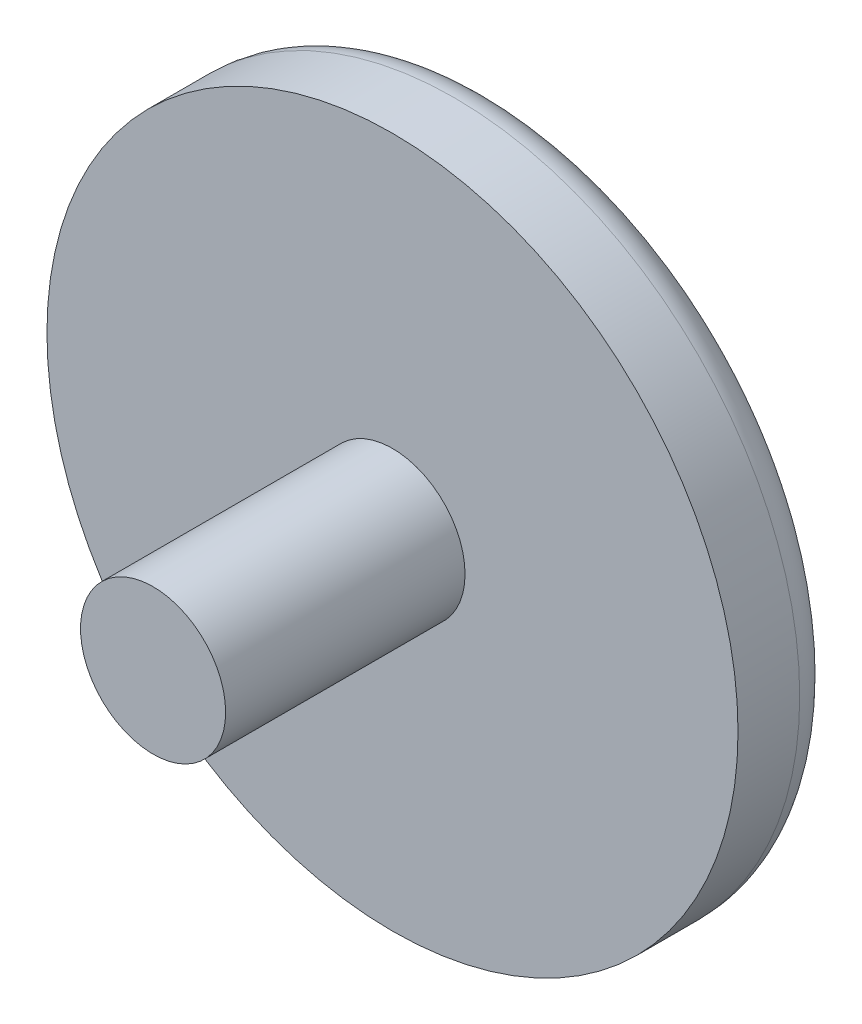
ISO-10303-21;
HEADER;
FILE_DESCRIPTION(('STEP AP214'),'2;1');
FILE_NAME('part.step','',(''),(''),'','','');
FILE_SCHEMA(('AUTOMOTIVE_DESIGN { 1 0 10303 214 1 1 1 1 }'));
ENDSEC;
DATA;
#1=APPLICATION_CONTEXT('core data for automotive mechanical design processes');
#2=APPLICATION_PROTOCOL_DEFINITION('international standard','automotive_design',2000,#1);
#3=PRODUCT_CONTEXT('',#1,'mechanical');
#4=PRODUCT('Part','Part','',(#3));
#5=PRODUCT_RELATED_PRODUCT_CATEGORY('part','',(#4));
#6=PRODUCT_DEFINITION_FORMATION('','',#4);
#7=PRODUCT_DEFINITION_CONTEXT('part definition',#1,'design');
#8=PRODUCT_DEFINITION('design','',#6,#7);
#9=PRODUCT_DEFINITION_SHAPE('','',#8);
#10=(LENGTH_UNIT() NAMED_UNIT(*) SI_UNIT(.MILLI.,.METRE.));
#11=(NAMED_UNIT(*) PLANE_ANGLE_UNIT() SI_UNIT($,.RADIAN.));
#12=(NAMED_UNIT(*) SI_UNIT($,.STERADIAN.) SOLID_ANGLE_UNIT());
#13=UNCERTAINTY_MEASURE_WITH_UNIT(LENGTH_MEASURE(1.E-05),#10,'distance_accuracy_value','');
#14=(GEOMETRIC_REPRESENTATION_CONTEXT(3) GLOBAL_UNCERTAINTY_ASSIGNED_CONTEXT((#13)) GLOBAL_UNIT_ASSIGNED_CONTEXT((#10,
#11,#12)) REPRESENTATION_CONTEXT('',''));
#15=CARTESIAN_POINT('',(0.,0.,0.));
#16=DIRECTION('',(0.,0.,1.));
#17=DIRECTION('',(1.,0.,0.));
#18=AXIS2_PLACEMENT_3D('',#15,#16,#17);
#19=CARTESIAN_POINT('',(0.,0.,4.));
#20=DIRECTION('',(0.,0.,-1.));
#21=DIRECTION('',(-1.,0.,0.));
#22=AXIS2_PLACEMENT_3D('',#19,#20,#21);
#23=CYLINDRICAL_SURFACE('',#22,14.);
#24=CARTESIAN_POINT('',(0.,0.,1.5));
#25=DIRECTION('',(0.,0.,1.));
#26=DIRECTION('',(1.,0.,0.));
#27=AXIS2_PLACEMENT_3D('',#24,#25,#26);
#28=CIRCLE('',#27,14.);
#29=CARTESIAN_POINT('',(14.,0.,1.5));
#30=VERTEX_POINT('',#29);
#31=EDGE_CURVE('E38',#30,#30,#28,.T.);
#32=ORIENTED_EDGE('',*,*,#31,.T.);
#33=EDGE_LOOP('',(#32));
#34=FACE_BOUND('',#33,.T.);
#35=CARTESIAN_POINT('',(0.,0.,4.));
#36=DIRECTION('',(0.,0.,1.));
#37=DIRECTION('',(1.,0.,0.));
#38=AXIS2_PLACEMENT_3D('',#35,#36,#37);
#39=CIRCLE('',#38,14.);
#40=CARTESIAN_POINT('',(14.,0.,4.));
#41=VERTEX_POINT('',#40);
#42=EDGE_CURVE('E55',#41,#41,#39,.T.);
#43=ORIENTED_EDGE('',*,*,#42,.F.);
#44=EDGE_LOOP('',(#43));
#45=FACE_BOUND('',#44,.T.);
#46=ADVANCED_FACE('F31',(#34,#45),#23,.T.);
#47=CARTESIAN_POINT('',(0.,0.,4.));
#48=DIRECTION('',(0.,0.,1.));
#49=DIRECTION('',(1.,0.,0.));
#50=AXIS2_PLACEMENT_3D('',#47,#48,#49);
#51=PLANE('',#50);
#52=CARTESIAN_POINT('',(0.,0.,4.));
#53=DIRECTION('',(0.,0.,1.));
#54=DIRECTION('',(1.,0.,0.));
#55=AXIS2_PLACEMENT_3D('',#52,#53,#54);
#56=CIRCLE('',#55,2.94);
#57=CARTESIAN_POINT('',(2.94,0.,4.));
#58=VERTEX_POINT('',#57);
#59=EDGE_CURVE('E51',#58,#58,#56,.T.);
#60=ORIENTED_EDGE('',*,*,#59,.F.);
#61=EDGE_LOOP('',(#60));
#62=FACE_BOUND('',#61,.T.);
#63=ORIENTED_EDGE('',*,*,#42,.T.);
#64=EDGE_LOOP('',(#63));
#65=FACE_BOUND('',#64,.T.);
#66=ADVANCED_FACE('F73',(#62,#65),#51,.T.);
#67=CARTESIAN_POINT('',(0.,0.,0.));
#68=DIRECTION('',(0.,0.,1.));
#69=DIRECTION('',(1.,0.,0.));
#70=AXIS2_PLACEMENT_3D('',#67,#68,#69);
#71=PLANE('',#70);
#72=CARTESIAN_POINT('',(0.,0.,0.));
#73=DIRECTION('',(0.,0.,1.));
#74=DIRECTION('',(1.,0.,0.));
#75=AXIS2_PLACEMENT_3D('',#72,#73,#74);
#76=CIRCLE('',#75,12.5);
#77=CARTESIAN_POINT('',(12.5,0.,0.));
#78=VERTEX_POINT('',#77);
#79=EDGE_CURVE('E10',#78,#78,#76,.F.);
#80=ORIENTED_EDGE('',*,*,#79,.T.);
#81=EDGE_LOOP('',(#80));
#82=FACE_BOUND('',#81,.T.);
#83=CARTESIAN_POINT('',(0.,0.,0.));
#84=DIRECTION('',(0.,0.,1.));
#85=DIRECTION('',(1.,0.,0.));
#86=AXIS2_PLACEMENT_3D('',#83,#84,#85);
#87=CIRCLE('',#86,11.5);
#88=CARTESIAN_POINT('',(11.5,0.,0.));
#89=VERTEX_POINT('',#88);
#90=EDGE_CURVE('E46',#89,#89,#87,.T.);
#91=ORIENTED_EDGE('',*,*,#90,.T.);
#92=EDGE_LOOP('',(#91));
#93=FACE_BOUND('',#92,.T.);
#94=ADVANCED_FACE('F69',(#82,#93),#71,.F.);
#95=CARTESIAN_POINT('',(0.,0.,13.7));
#96=DIRECTION('',(0.,0.,-1.));
#97=DIRECTION('',(-1.,0.,0.));
#98=AXIS2_PLACEMENT_3D('',#95,#96,#97);
#99=CYLINDRICAL_SURFACE('',#98,2.94);
#100=CARTESIAN_POINT('',(0.,0.,13.7));
#101=DIRECTION('',(0.,0.,1.));
#102=DIRECTION('',(1.,0.,0.));
#103=AXIS2_PLACEMENT_3D('',#100,#101,#102);
#104=CIRCLE('',#103,2.94);
#105=CARTESIAN_POINT('',(2.94,0.,13.7));
#106=VERTEX_POINT('',#105);
#107=EDGE_CURVE('E58',#106,#106,#104,.T.);
#108=ORIENTED_EDGE('',*,*,#107,.F.);
#109=EDGE_LOOP('',(#108));
#110=FACE_BOUND('',#109,.T.);
#111=ORIENTED_EDGE('',*,*,#59,.T.);
#112=EDGE_LOOP('',(#111));
#113=FACE_BOUND('',#112,.T.);
#114=ADVANCED_FACE('F66',(#110,#113),#99,.T.);
#115=CARTESIAN_POINT('',(0.,0.,13.7));
#116=DIRECTION('',(0.,0.,1.));
#117=DIRECTION('',(1.,0.,0.));
#118=AXIS2_PLACEMENT_3D('',#115,#116,#117);
#119=PLANE('',#118);
#120=ORIENTED_EDGE('',*,*,#107,.T.);
#121=EDGE_LOOP('',(#120));
#122=FACE_BOUND('',#121,.T.);
#123=ADVANCED_FACE('F64',(#122),#119,.T.);
#124=CARTESIAN_POINT('',(0.,0.,1.));
#125=DIRECTION('',(0.,0.,-1.));
#126=DIRECTION('',(-1.,0.,0.));
#127=AXIS2_PLACEMENT_3D('',#124,#125,#126);
#128=PLANE('',#127);
#129=CARTESIAN_POINT('',(0.,0.,1.));
#130=DIRECTION('',(0.,0.,-1.));
#131=DIRECTION('',(-1.,0.,0.));
#132=AXIS2_PLACEMENT_3D('',#129,#130,#131);
#133=CIRCLE('',#132,10.5);
#134=CARTESIAN_POINT('',(-10.5,0.,1.));
#135=VERTEX_POINT('',#134);
#136=EDGE_CURVE('E42',#135,#135,#133,.T.);
#137=ORIENTED_EDGE('',*,*,#136,.T.);
#138=EDGE_LOOP('',(#137));
#139=FACE_BOUND('',#138,.T.);
#140=ADVANCED_FACE('F90',(#139),#128,.T.);
#141=CARTESIAN_POINT('',(0.,0.,0.5));
#142=DIRECTION('',(0.,0.,-1.));
#143=DIRECTION('',(-1.,0.,0.));
#144=AXIS2_PLACEMENT_3D('',#141,#142,#143);
#145=TOROIDAL_SURFACE('',#144,10.5,0.5);
#146=ORIENTED_EDGE('',*,*,#136,.F.);
#147=EDGE_LOOP('',(#146));
#148=FACE_BOUND('',#147,.T.);
#149=CARTESIAN_POINT('',(0.,0.,0.5));
#150=DIRECTION('',(0.,0.,-1.));
#151=DIRECTION('',(-1.,0.,0.));
#152=AXIS2_PLACEMENT_3D('',#149,#150,#151);
#153=CIRCLE('',#152,11.);
#154=CARTESIAN_POINT('',(-11.,0.,0.5));
#155=VERTEX_POINT('',#154);
#156=EDGE_CURVE('E49',#155,#155,#153,.F.);
#157=ORIENTED_EDGE('',*,*,#156,.F.);
#158=EDGE_LOOP('',(#157));
#159=FACE_BOUND('',#158,.T.);
#160=ADVANCED_FACE('F87',(#148,#159),#145,.F.);
#161=CARTESIAN_POINT('',(0.,0.,0.5));
#162=DIRECTION('',(0.,0.,1.));
#163=DIRECTION('',(1.,0.,0.));
#164=AXIS2_PLACEMENT_3D('',#161,#162,#163);
#165=TOROIDAL_SURFACE('',#164,11.5,0.5);
#166=ORIENTED_EDGE('',*,*,#90,.F.);
#167=EDGE_LOOP('',(#166));
#168=FACE_BOUND('',#167,.T.);
#169=ORIENTED_EDGE('',*,*,#156,.T.);
#170=EDGE_LOOP('',(#169));
#171=FACE_BOUND('',#170,.T.);
#172=ADVANCED_FACE('F85',(#168,#171),#165,.T.);
#173=CARTESIAN_POINT('',(0.,0.,1.5));
#174=DIRECTION('',(0.,0.,1.));
#175=DIRECTION('',(1.,0.,0.));
#176=AXIS2_PLACEMENT_3D('',#173,#174,#175);
#177=TOROIDAL_SURFACE('',#176,12.5,1.5);
#178=ORIENTED_EDGE('',*,*,#79,.F.);
#179=EDGE_LOOP('',(#178));
#180=FACE_BOUND('',#179,.T.);
#181=ORIENTED_EDGE('',*,*,#31,.F.);
#182=EDGE_LOOP('',(#181));
#183=FACE_BOUND('',#182,.T.);
#184=ADVANCED_FACE('F33',(#180,#183),#177,.T.);
#185=CLOSED_SHELL('',(#46,#66,#94,#114,#123,#140,#160,#172,#184));
#186=MANIFOLD_SOLID_BREP('B2',#185);
#187=ADVANCED_BREP_SHAPE_REPRESENTATION('',(#18,#186),#14);
#188=SHAPE_DEFINITION_REPRESENTATION(#9,#187);
ENDSEC;
END-ISO-10303-21;
